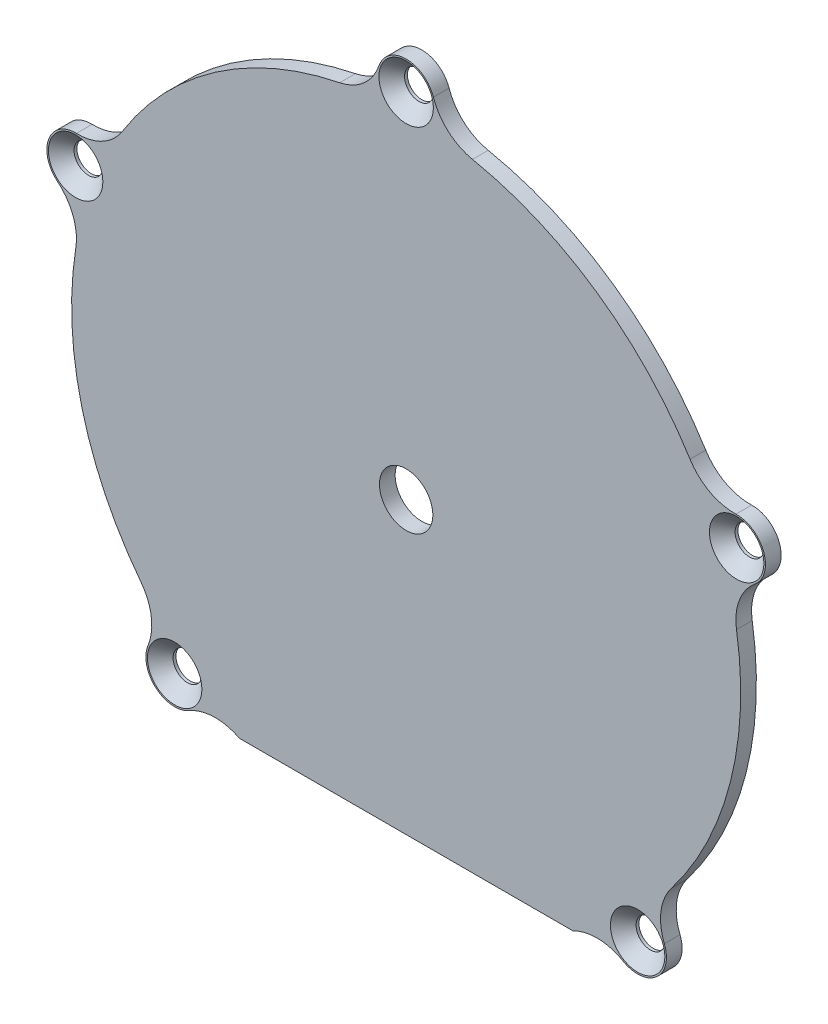
ISO-10303-21;
HEADER;
FILE_DESCRIPTION(('STEP AP214'),'2;1');
FILE_NAME('part.step','',(''),(''),'','','');
FILE_SCHEMA(('AUTOMOTIVE_DESIGN { 1 0 10303 214 1 1 1 1 }'));
ENDSEC;
DATA;
#1=APPLICATION_CONTEXT('core data for automotive mechanical design processes');
#2=APPLICATION_PROTOCOL_DEFINITION('international standard','automotive_design',2000,#1);
#3=PRODUCT_CONTEXT('',#1,'mechanical');
#4=PRODUCT('Part','Part','',(#3));
#5=PRODUCT_RELATED_PRODUCT_CATEGORY('part','',(#4));
#6=PRODUCT_DEFINITION_FORMATION('','',#4);
#7=PRODUCT_DEFINITION_CONTEXT('part definition',#1,'design');
#8=PRODUCT_DEFINITION('design','',#6,#7);
#9=PRODUCT_DEFINITION_SHAPE('','',#8);
#10=(LENGTH_UNIT() NAMED_UNIT(*) SI_UNIT(.MILLI.,.METRE.));
#11=(NAMED_UNIT(*) PLANE_ANGLE_UNIT() SI_UNIT($,.RADIAN.));
#12=(NAMED_UNIT(*) SI_UNIT($,.STERADIAN.) SOLID_ANGLE_UNIT());
#13=UNCERTAINTY_MEASURE_WITH_UNIT(LENGTH_MEASURE(1.E-05),#10,'distance_accuracy_value','');
#14=(GEOMETRIC_REPRESENTATION_CONTEXT(3) GLOBAL_UNCERTAINTY_ASSIGNED_CONTEXT((#13)) GLOBAL_UNIT_ASSIGNED_CONTEXT((#10,
#11,#12)) REPRESENTATION_CONTEXT('',''));
#15=CARTESIAN_POINT('',(0.,0.,0.));
#16=DIRECTION('',(0.,0.,1.));
#17=DIRECTION('',(1.,0.,0.));
#18=AXIS2_PLACEMENT_3D('',#15,#16,#17);
#19=CARTESIAN_POINT('',(-36.4504390235777,-64.2826614521123,3.));
#20=DIRECTION('',(0.,0.,-1.));
#21=DIRECTION('',(-1.,0.,0.));
#22=AXIS2_PLACEMENT_3D('',#19,#20,#21);
#23=CYLINDRICAL_SURFACE('',#22,10.);
#24=CARTESIAN_POINT('',(-36.4504390235777,-64.2826614521123,0.));
#25=DIRECTION('',(0.,0.,-1.));
#26=DIRECTION('',(1.,0.,0.));
#27=AXIS2_PLACEMENT_3D('',#24,#25,#26);
#28=CIRCLE('',#27,10.);
#29=CARTESIAN_POINT('',(-41.4645158414446,-55.6305499373126,0.));
#30=VERTEX_POINT('',#29);
#31=CARTESIAN_POINT('',(-31.8457301336344,-55.4059133967219,0.));
#32=VERTEX_POINT('',#31);
#33=EDGE_CURVE('E203',#30,#32,#28,.T.);
#34=ORIENTED_EDGE('',*,*,#33,.T.);
#35=DIRECTION('',(0.,0.,-1.));
#36=VECTOR('',#35,1.);
#37=CARTESIAN_POINT('',(-31.8457301336344,-55.4059133967219,3.));
#38=LINE('',#37,#36);
#39=CARTESIAN_POINT('',(-31.8457301336344,-55.4059133967219,3.));
#40=VERTEX_POINT('',#39);
#41=EDGE_CURVE('E11',#40,#32,#38,.T.);
#42=ORIENTED_EDGE('',*,*,#41,.F.);
#43=CARTESIAN_POINT('',(-36.4504390235777,-64.2826614521123,3.));
#44=DIRECTION('',(0.,0.,-1.));
#45=DIRECTION('',(1.,0.,0.));
#46=AXIS2_PLACEMENT_3D('',#43,#44,#45);
#47=CIRCLE('',#46,10.);
#48=CARTESIAN_POINT('',(-41.4645158414446,-55.6305499373126,3.));
#49=VERTEX_POINT('',#48);
#50=EDGE_CURVE('E242',#49,#40,#47,.T.);
#51=ORIENTED_EDGE('',*,*,#50,.F.);
#52=DIRECTION('',(0.,0.,-1.));
#53=VECTOR('',#52,1.);
#54=CARTESIAN_POINT('',(-41.4645158414446,-55.6305499373126,3.));
#55=LINE('',#54,#53);
#56=EDGE_CURVE('E199',#49,#30,#55,.T.);
#57=ORIENTED_EDGE('',*,*,#56,.T.);
#58=EDGE_LOOP('',(#34,#42,#51,#57));
#59=FACE_BOUND('',#58,.T.);
#60=ADVANCED_FACE('F35',(#59),#23,.F.);
#61=CARTESIAN_POINT('',(0.,-55.4059133967219,3.));
#62=DIRECTION('',(0.,1.,0.));
#63=DIRECTION('',(0.,0.,1.));
#64=AXIS2_PLACEMENT_3D('',#61,#62,#63);
#65=PLANE('',#64);
#66=DIRECTION('',(1.,0.,0.));
#67=VECTOR('',#66,1.);
#68=CARTESIAN_POINT('',(0.,-55.4059133967219,0.));
#69=LINE('',#68,#67);
#70=CARTESIAN_POINT('',(31.8457301336344,-55.4059133967219,0.));
#71=VERTEX_POINT('',#70);
#72=EDGE_CURVE('E206',#32,#71,#69,.T.);
#73=ORIENTED_EDGE('',*,*,#72,.T.);
#74=DIRECTION('',(0.,0.,-1.));
#75=VECTOR('',#74,1.);
#76=CARTESIAN_POINT('',(31.8457301336344,-55.4059133967219,3.));
#77=LINE('',#76,#75);
#78=CARTESIAN_POINT('',(31.8457301336344,-55.4059133967219,3.));
#79=VERTEX_POINT('',#78);
#80=EDGE_CURVE('E43',#79,#71,#77,.T.);
#81=ORIENTED_EDGE('',*,*,#80,.F.);
#82=DIRECTION('',(1.,0.,0.));
#83=VECTOR('',#82,1.);
#84=CARTESIAN_POINT('',(-31.8457301336344,-55.4059133967219,3.));
#85=LINE('',#84,#83);
#86=EDGE_CURVE('E130',#40,#79,#85,.T.);
#87=ORIENTED_EDGE('',*,*,#86,.F.);
#88=ORIENTED_EDGE('',*,*,#41,.T.);
#89=EDGE_LOOP('',(#73,#81,#87,#88));
#90=FACE_BOUND('',#89,.T.);
#91=ADVANCED_FACE('F362',(#90),#65,.F.);
#92=CARTESIAN_POINT('',(36.4504390235777,-64.2826614521123,3.));
#93=DIRECTION('',(0.,0.,-1.));
#94=DIRECTION('',(-1.,0.,0.));
#95=AXIS2_PLACEMENT_3D('',#92,#93,#94);
#96=CYLINDRICAL_SURFACE('',#95,10.);
#97=CARTESIAN_POINT('',(36.4504390235777,-64.2826614521123,0.));
#98=DIRECTION('',(0.,0.,-1.));
#99=DIRECTION('',(1.,0.,0.));
#100=AXIS2_PLACEMENT_3D('',#97,#98,#99);
#101=CIRCLE('',#100,10.);
#102=CARTESIAN_POINT('',(41.4645158414446,-55.6305499373126,0.));
#103=VERTEX_POINT('',#102);
#104=EDGE_CURVE('E209',#71,#103,#101,.T.);
#105=ORIENTED_EDGE('',*,*,#104,.T.);
#106=DIRECTION('',(0.,0.,-1.));
#107=VECTOR('',#106,1.);
#108=CARTESIAN_POINT('',(41.4645158414446,-55.6305499373126,3.));
#109=LINE('',#108,#107);
#110=CARTESIAN_POINT('',(41.4645158414446,-55.6305499373126,3.));
#111=VERTEX_POINT('',#110);
#112=EDGE_CURVE('E285',#111,#103,#109,.T.);
#113=ORIENTED_EDGE('',*,*,#112,.F.);
#114=CARTESIAN_POINT('',(36.4504390235777,-64.2826614521123,3.));
#115=DIRECTION('',(0.,0.,-1.));
#116=DIRECTION('',(1.,0.,0.));
#117=AXIS2_PLACEMENT_3D('',#114,#115,#116);
#118=CIRCLE('',#117,10.);
#119=EDGE_CURVE('E293',#79,#111,#118,.T.);
#120=ORIENTED_EDGE('',*,*,#119,.F.);
#121=ORIENTED_EDGE('',*,*,#80,.T.);
#122=EDGE_LOOP('',(#105,#113,#120,#121));
#123=FACE_BOUND('',#122,.T.);
#124=ADVANCED_FACE('F291',(#123),#96,.F.);
#125=CARTESIAN_POINT('',(44.2222580912713,-50.8718886041727,3.));
#126=DIRECTION('',(0.,0.,-1.));
#127=DIRECTION('',(-1.,0.,0.));
#128=AXIS2_PLACEMENT_3D('',#125,#126,#127);
#129=CYLINDRICAL_SURFACE('',#128,5.5);
#130=CARTESIAN_POINT('',(44.2222580912713,-50.8718886041727,0.));
#131=DIRECTION('',(0.,0.,1.));
#132=DIRECTION('',(1.,0.,0.));
#133=AXIS2_PLACEMENT_3D('',#130,#131,#132);
#134=CIRCLE('',#133,5.5);
#135=CARTESIAN_POINT('',(49.3196553754128,-48.8063279229951,0.));
#136=VERTEX_POINT('',#135);
#137=EDGE_CURVE('E211',#103,#136,#134,.T.);
#138=ORIENTED_EDGE('',*,*,#137,.T.);
#139=DIRECTION('',(0.,0.,-1.));
#140=VECTOR('',#139,1.);
#141=CARTESIAN_POINT('',(49.3196553754128,-48.8063279229951,3.));
#142=LINE('',#141,#140);
#143=CARTESIAN_POINT('',(49.3196553754128,-48.8063279229951,3.));
#144=VERTEX_POINT('',#143);
#145=EDGE_CURVE('E282',#144,#136,#142,.T.);
#146=ORIENTED_EDGE('',*,*,#145,.F.);
#147=CARTESIAN_POINT('',(44.2222580912713,-50.8718886041727,3.));
#148=DIRECTION('',(0.,0.,1.));
#149=DIRECTION('',(1.,0.,0.));
#150=AXIS2_PLACEMENT_3D('',#147,#148,#149);
#151=CIRCLE('',#150,5.5);
#152=EDGE_CURVE('E311',#111,#144,#151,.T.);
#153=ORIENTED_EDGE('',*,*,#152,.F.);
#154=ORIENTED_EDGE('',*,*,#112,.T.);
#155=EDGE_LOOP('',(#138,#146,#153,#154));
#156=FACE_BOUND('',#155,.T.);
#157=ADVANCED_FACE('F302',(#156),#129,.T.);
#158=CARTESIAN_POINT('',(58.5876504374882,-45.0507630481266,3.));
#159=DIRECTION('',(0.,0.,-1.));
#160=DIRECTION('',(-1.,0.,0.));
#161=AXIS2_PLACEMENT_3D('',#158,#159,#160);
#162=CYLINDRICAL_SURFACE('',#161,10.);
#163=CARTESIAN_POINT('',(58.5876504374882,-45.0507630481266,0.));
#164=DIRECTION('',(0.,0.,-1.));
#165=DIRECTION('',(1.,0.,0.));
#166=AXIS2_PLACEMENT_3D('',#163,#164,#165);
#167=CIRCLE('',#166,10.);
#168=CARTESIAN_POINT('',(50.6603212503102,-38.9550717864142,0.));
#169=VERTEX_POINT('',#168);
#170=EDGE_CURVE('E213',#136,#169,#167,.T.);
#171=ORIENTED_EDGE('',*,*,#170,.T.);
#172=DIRECTION('',(0.,0.,-1.));
#173=VECTOR('',#172,1.);
#174=CARTESIAN_POINT('',(50.6603212503102,-38.9550717864142,3.));
#175=LINE('',#174,#173);
#176=CARTESIAN_POINT('',(50.6603212503102,-38.9550717864142,3.));
#177=VERTEX_POINT('',#176);
#178=EDGE_CURVE('E279',#177,#169,#175,.T.);
#179=ORIENTED_EDGE('',*,*,#178,.F.);
#180=CARTESIAN_POINT('',(58.5876504374882,-45.0507630481266,3.));
#181=DIRECTION('',(0.,0.,-1.));
#182=DIRECTION('',(1.,0.,0.));
#183=AXIS2_PLACEMENT_3D('',#180,#181,#182);
#184=CIRCLE('',#183,10.);
#185=EDGE_CURVE('E308',#144,#177,#184,.T.);
#186=ORIENTED_EDGE('',*,*,#185,.F.);
#187=ORIENTED_EDGE('',*,*,#145,.T.);
#188=EDGE_LOOP('',(#171,#179,#186,#187));
#189=FACE_BOUND('',#188,.T.);
#190=ADVANCED_FACE('F306',(#189),#162,.F.);
#191=CARTESIAN_POINT('',(0.,0.,3.));
#192=DIRECTION('',(0.,0.,-1.));
#193=DIRECTION('',(-1.,0.,0.));
#194=AXIS2_PLACEMENT_3D('',#191,#192,#193);
#195=CYLINDRICAL_SURFACE('',#194,63.9059133967219);
#196=CARTESIAN_POINT('',(0.,0.,0.));
#197=DIRECTION('',(0.,0.,1.));
#198=DIRECTION('',(1.,0.,0.));
#199=AXIS2_PLACEMENT_3D('',#196,#197,#198);
#200=CIRCLE('',#199,63.9059133967219);
#201=CARTESIAN_POINT('',(63.1089110071548,10.0613676287241,0.));
#202=VERTEX_POINT('',#201);
#203=EDGE_CURVE('E215',#169,#202,#200,.T.);
#204=ORIENTED_EDGE('',*,*,#203,.T.);
#205=DIRECTION('',(0.,0.,-1.));
#206=VECTOR('',#205,1.);
#207=CARTESIAN_POINT('',(63.1089110071548,10.0613676287241,3.));
#208=LINE('',#207,#206);
#209=CARTESIAN_POINT('',(63.1089110071548,10.0613676287241,3.));
#210=VERTEX_POINT('',#209);
#211=EDGE_CURVE('E276',#210,#202,#208,.T.);
#212=ORIENTED_EDGE('',*,*,#211,.F.);
#213=CARTESIAN_POINT('',(0.,0.,3.));
#214=DIRECTION('',(0.,0.,1.));
#215=DIRECTION('',(1.,0.,0.));
#216=AXIS2_PLACEMENT_3D('',#213,#214,#215);
#217=CIRCLE('',#216,63.9059133967219);
#218=EDGE_CURVE('E310',#177,#210,#217,.T.);
#219=ORIENTED_EDGE('',*,*,#218,.F.);
#220=ORIENTED_EDGE('',*,*,#178,.T.);
#221=EDGE_LOOP('',(#204,#212,#219,#220));
#222=FACE_BOUND('',#221,.T.);
#223=ADVANCED_FACE('F375',(#222),#195,.T.);
#224=CARTESIAN_POINT('',(72.9841960399154,11.6357708558972,3.));
#225=DIRECTION('',(0.,0.,-1.));
#226=DIRECTION('',(-1.,0.,0.));
#227=AXIS2_PLACEMENT_3D('',#224,#225,#226);
#228=CYLINDRICAL_SURFACE('',#227,10.);
#229=CARTESIAN_POINT('',(72.9841960399154,11.6357708558972,0.));
#230=DIRECTION('',(0.,0.,-1.));
#231=DIRECTION('',(1.,0.,0.));
#232=AXIS2_PLACEMENT_3D('',#229,#230,#231);
#233=CIRCLE('',#232,10.);
#234=CARTESIAN_POINT('',(66.6313240590638,19.3585305695559,0.));
#235=VERTEX_POINT('',#234);
#236=EDGE_CURVE('E217',#202,#235,#233,.T.);
#237=ORIENTED_EDGE('',*,*,#236,.T.);
#238=DIRECTION('',(0.,0.,-1.));
#239=VECTOR('',#238,1.);
#240=CARTESIAN_POINT('',(66.6313240590638,19.3585305695559,3.));
#241=LINE('',#240,#239);
#242=CARTESIAN_POINT('',(66.6313240590638,19.3585305695559,3.));
#243=VERTEX_POINT('',#242);
#244=EDGE_CURVE('E273',#243,#235,#241,.T.);
#245=ORIENTED_EDGE('',*,*,#244,.F.);
#246=CARTESIAN_POINT('',(72.9841960399154,11.6357708558972,3.));
#247=DIRECTION('',(0.,0.,-1.));
#248=DIRECTION('',(1.,0.,0.));
#249=AXIS2_PLACEMENT_3D('',#246,#247,#248);
#250=CIRCLE('',#249,10.);
#251=EDGE_CURVE('E313',#210,#243,#250,.T.);
#252=ORIENTED_EDGE('',*,*,#251,.F.);
#253=ORIENTED_EDGE('',*,*,#211,.T.);
#254=EDGE_LOOP('',(#237,#245,#252,#253));
#255=FACE_BOUND('',#254,.T.);
#256=ADVANCED_FACE('F378',(#255),#228,.F.);
#257=CARTESIAN_POINT('',(63.1372444695955,23.6060484120683,3.));
#258=DIRECTION('',(0.,0.,-1.));
#259=DIRECTION('',(-1.,0.,0.));
#260=AXIS2_PLACEMENT_3D('',#257,#258,#259);
#261=CYLINDRICAL_SURFACE('',#260,5.5);
#262=CARTESIAN_POINT('',(63.1372444695955,23.6060484120683,0.));
#263=DIRECTION('',(0.,0.,1.));
#264=DIRECTION('',(1.,0.,0.));
#265=AXIS2_PLACEMENT_3D('',#262,#263,#264);
#266=CIRCLE('',#265,5.5);
#267=CARTESIAN_POINT('',(62.9876373784496,29.1040132826617,0.));
#268=VERTEX_POINT('',#267);
#269=EDGE_CURVE('E219',#235,#268,#266,.T.);
#270=ORIENTED_EDGE('',*,*,#269,.T.);
#271=DIRECTION('',(0.,0.,-1.));
#272=VECTOR('',#271,1.);
#273=CARTESIAN_POINT('',(62.9876373784496,29.1040132826617,3.));
#274=LINE('',#273,#272);
#275=CARTESIAN_POINT('',(62.9876373784496,29.1040132826617,3.));
#276=VERTEX_POINT('',#275);
#277=EDGE_CURVE('E270',#276,#268,#274,.T.);
#278=ORIENTED_EDGE('',*,*,#277,.F.);
#279=CARTESIAN_POINT('',(63.1372444695955,23.6060484120683,3.));
#280=DIRECTION('',(0.,0.,1.));
#281=DIRECTION('',(1.,0.,0.));
#282=AXIS2_PLACEMENT_3D('',#279,#280,#281);
#283=CIRCLE('',#282,5.5);
#284=EDGE_CURVE('E319',#243,#276,#283,.T.);
#285=ORIENTED_EDGE('',*,*,#284,.F.);
#286=ORIENTED_EDGE('',*,*,#244,.T.);
#287=EDGE_LOOP('',(#270,#278,#285,#286));
#288=FACE_BOUND('',#287,.T.);
#289=ADVANCED_FACE('F382',(#288),#261,.T.);
#290=CARTESIAN_POINT('',(62.7156244854572,39.1003130473769,3.));
#291=DIRECTION('',(0.,0.,-1.));
#292=DIRECTION('',(-1.,0.,0.));
#293=AXIS2_PLACEMENT_3D('',#290,#291,#292);
#294=CYLINDRICAL_SURFACE('',#293,10.);
#295=CARTESIAN_POINT('',(62.7156244854572,39.1003130473769,0.));
#296=DIRECTION('',(0.,0.,-1.));
#297=DIRECTION('',(1.,0.,0.));
#298=AXIS2_PLACEMENT_3D('',#295,#296,#297);
#299=CIRCLE('',#298,10.);
#300=CARTESIAN_POINT('',(54.2297508113435,33.8097603364606,0.));
#301=VERTEX_POINT('',#300);
#302=EDGE_CURVE('E221',#268,#301,#299,.T.);
#303=ORIENTED_EDGE('',*,*,#302,.T.);
#304=DIRECTION('',(0.,0.,-1.));
#305=VECTOR('',#304,1.);
#306=CARTESIAN_POINT('',(54.2297508113435,33.8097603364606,3.));
#307=LINE('',#306,#305);
#308=CARTESIAN_POINT('',(54.2297508113435,33.8097603364606,3.));
#309=VERTEX_POINT('',#308);
#310=EDGE_CURVE('E267',#309,#301,#307,.T.);
#311=ORIENTED_EDGE('',*,*,#310,.F.);
#312=CARTESIAN_POINT('',(62.7156244854572,39.1003130473769,3.));
#313=DIRECTION('',(0.,0.,-1.));
#314=DIRECTION('',(1.,0.,0.));
#315=AXIS2_PLACEMENT_3D('',#312,#313,#314);
#316=CIRCLE('',#315,10.);
#317=EDGE_CURVE('E321',#276,#309,#316,.T.);
#318=ORIENTED_EDGE('',*,*,#317,.F.);
#319=ORIENTED_EDGE('',*,*,#277,.T.);
#320=EDGE_LOOP('',(#303,#311,#318,#319));
#321=FACE_BOUND('',#320,.T.);
#322=ADVANCED_FACE('F386',(#321),#294,.F.);
#323=CARTESIAN_POINT('',(0.,0.,3.));
#324=DIRECTION('',(0.,0.,-1.));
#325=DIRECTION('',(-1.,0.,0.));
#326=AXIS2_PLACEMENT_3D('',#323,#324,#325);
#327=CYLINDRICAL_SURFACE('',#326,63.9059133967219);
#328=CARTESIAN_POINT('',(0.,0.,0.));
#329=DIRECTION('',(0.,0.,1.));
#330=DIRECTION('',(1.,0.,0.));
#331=AXIS2_PLACEMENT_3D('',#328,#329,#330);
#332=CIRCLE('',#331,63.9059133967219);
#333=CARTESIAN_POINT('',(12.6770032143223,62.6359270432982,0.));
#334=VERTEX_POINT('',#333);
#335=EDGE_CURVE('E223',#301,#334,#332,.T.);
#336=ORIENTED_EDGE('',*,*,#335,.T.);
#337=DIRECTION('',(0.,0.,-1.));
#338=VECTOR('',#337,1.);
#339=CARTESIAN_POINT('',(12.6770032143223,62.6359270432982,3.));
#340=LINE('',#339,#338);
#341=CARTESIAN_POINT('',(12.6770032143223,62.6359270432982,3.));
#342=VERTEX_POINT('',#341);
#343=EDGE_CURVE('E264',#342,#334,#340,.T.);
#344=ORIENTED_EDGE('',*,*,#343,.F.);
#345=CARTESIAN_POINT('',(0.,0.,3.));
#346=DIRECTION('',(0.,0.,1.));
#347=DIRECTION('',(1.,0.,0.));
#348=AXIS2_PLACEMENT_3D('',#345,#346,#347);
#349=CIRCLE('',#348,63.9059133967219);
#350=EDGE_CURVE('E323',#309,#342,#349,.T.);
#351=ORIENTED_EDGE('',*,*,#350,.F.);
#352=ORIENTED_EDGE('',*,*,#310,.T.);
#353=EDGE_LOOP('',(#336,#344,#351,#352));
#354=FACE_BOUND('',#353,.T.);
#355=ADVANCED_FACE('F390',(#354),#327,.T.);
#356=CARTESIAN_POINT('',(14.6607012072803,72.4371995256209,3.));
#357=DIRECTION('',(0.,0.,-1.));
#358=DIRECTION('',(-1.,0.,0.));
#359=AXIS2_PLACEMENT_3D('',#356,#357,#358);
#360=CYLINDRICAL_SURFACE('',#359,10.);
#361=CARTESIAN_POINT('',(14.6607012072803,72.4371995256209,0.));
#362=DIRECTION('',(0.,0.,-1.));
#363=DIRECTION('',(1.,0.,0.));
#364=AXIS2_PLACEMENT_3D('',#361,#362,#363);
#365=CIRCLE('',#364,10.);
#366=CARTESIAN_POINT('',(5.20218429935753,69.1912084747183,0.));
#367=VERTEX_POINT('',#366);
#368=EDGE_CURVE('E225',#334,#367,#365,.T.);
#369=ORIENTED_EDGE('',*,*,#368,.T.);
#370=DIRECTION('',(0.,0.,-1.));
#371=VECTOR('',#370,1.);
#372=CARTESIAN_POINT('',(5.20218429935753,69.1912084747183,3.));
#373=LINE('',#372,#371);
#374=CARTESIAN_POINT('',(5.20218429935753,69.1912084747183,3.));
#375=VERTEX_POINT('',#374);
#376=EDGE_CURVE('E261',#375,#367,#373,.T.);
#377=ORIENTED_EDGE('',*,*,#376,.F.);
#378=CARTESIAN_POINT('',(14.6607012072803,72.4371995256209,3.));
#379=DIRECTION('',(0.,0.,-1.));
#380=DIRECTION('',(1.,0.,0.));
#381=AXIS2_PLACEMENT_3D('',#378,#379,#380);
#382=CIRCLE('',#381,10.);
#383=EDGE_CURVE('E325',#342,#375,#382,.T.);
#384=ORIENTED_EDGE('',*,*,#383,.F.);
#385=ORIENTED_EDGE('',*,*,#343,.T.);
#386=EDGE_LOOP('',(#369,#377,#384,#385));
#387=FACE_BOUND('',#386,.T.);
#388=ADVANCED_FACE('F394',(#387),#360,.F.);
#389=CARTESIAN_POINT('',(0.,67.4059133967219,3.));
#390=DIRECTION('',(0.,0.,-1.));
#391=DIRECTION('',(-1.,0.,0.));
#392=AXIS2_PLACEMENT_3D('',#389,#390,#391);
#393=CYLINDRICAL_SURFACE('',#392,5.50000000000001);
#394=CARTESIAN_POINT('',(0.,67.4059133967219,0.));
#395=DIRECTION('',(0.,0.,1.));
#396=DIRECTION('',(1.,0.,0.));
#397=AXIS2_PLACEMENT_3D('',#394,#395,#396);
#398=CIRCLE('',#397,5.50000000000001);
#399=CARTESIAN_POINT('',(-5.20218429935752,69.1912084747183,0.));
#400=VERTEX_POINT('',#399);
#401=EDGE_CURVE('E227',#367,#400,#398,.T.);
#402=ORIENTED_EDGE('',*,*,#401,.T.);
#403=DIRECTION('',(0.,0.,-1.));
#404=VECTOR('',#403,1.);
#405=CARTESIAN_POINT('',(-5.20218429935752,69.1912084747183,3.));
#406=LINE('',#405,#404);
#407=CARTESIAN_POINT('',(-5.20218429935752,69.1912084747183,3.));
#408=VERTEX_POINT('',#407);
#409=EDGE_CURVE('E258',#408,#400,#406,.T.);
#410=ORIENTED_EDGE('',*,*,#409,.F.);
#411=CARTESIAN_POINT('',(0.,67.4059133967219,3.));
#412=DIRECTION('',(0.,0.,1.));
#413=DIRECTION('',(1.,0.,0.));
#414=AXIS2_PLACEMENT_3D('',#411,#412,#413);
#415=CIRCLE('',#414,5.50000000000001);
#416=EDGE_CURVE('E327',#375,#408,#415,.T.);
#417=ORIENTED_EDGE('',*,*,#416,.F.);
#418=ORIENTED_EDGE('',*,*,#376,.T.);
#419=EDGE_LOOP('',(#402,#410,#417,#418));
#420=FACE_BOUND('',#419,.T.);
#421=ADVANCED_FACE('F398',(#420),#393,.T.);
#422=CARTESIAN_POINT('',(-14.6607012072803,72.4371995256209,3.));
#423=DIRECTION('',(0.,0.,-1.));
#424=DIRECTION('',(-1.,0.,0.));
#425=AXIS2_PLACEMENT_3D('',#422,#423,#424);
#426=CYLINDRICAL_SURFACE('',#425,10.);
#427=CARTESIAN_POINT('',(-14.6607012072803,72.4371995256209,0.));
#428=DIRECTION('',(0.,0.,-1.));
#429=DIRECTION('',(1.,0.,0.));
#430=AXIS2_PLACEMENT_3D('',#427,#428,#429);
#431=CIRCLE('',#430,10.);
#432=CARTESIAN_POINT('',(-12.6770032143223,62.6359270432982,0.));
#433=VERTEX_POINT('',#432);
#434=EDGE_CURVE('E229',#400,#433,#431,.T.);
#435=ORIENTED_EDGE('',*,*,#434,.T.);
#436=DIRECTION('',(0.,0.,-1.));
#437=VECTOR('',#436,1.);
#438=CARTESIAN_POINT('',(-12.6770032143223,62.6359270432982,3.));
#439=LINE('',#438,#437);
#440=CARTESIAN_POINT('',(-12.6770032143223,62.6359270432982,3.));
#441=VERTEX_POINT('',#440);
#442=EDGE_CURVE('E255',#441,#433,#439,.T.);
#443=ORIENTED_EDGE('',*,*,#442,.F.);
#444=CARTESIAN_POINT('',(-14.6607012072803,72.4371995256209,3.));
#445=DIRECTION('',(0.,0.,-1.));
#446=DIRECTION('',(1.,0.,0.));
#447=AXIS2_PLACEMENT_3D('',#444,#445,#446);
#448=CIRCLE('',#447,10.);
#449=EDGE_CURVE('E329',#408,#441,#448,.T.);
#450=ORIENTED_EDGE('',*,*,#449,.F.);
#451=ORIENTED_EDGE('',*,*,#409,.T.);
#452=EDGE_LOOP('',(#435,#443,#450,#451));
#453=FACE_BOUND('',#452,.T.);
#454=ADVANCED_FACE('F402',(#453),#426,.F.);
#455=CARTESIAN_POINT('',(0.,0.,3.));
#456=DIRECTION('',(0.,0.,-1.));
#457=DIRECTION('',(-1.,0.,0.));
#458=AXIS2_PLACEMENT_3D('',#455,#456,#457);
#459=CYLINDRICAL_SURFACE('',#458,63.9059133967219);
#460=CARTESIAN_POINT('',(0.,0.,0.));
#461=DIRECTION('',(0.,0.,1.));
#462=DIRECTION('',(1.,0.,0.));
#463=AXIS2_PLACEMENT_3D('',#460,#461,#462);
#464=CIRCLE('',#463,63.9059133967219);
#465=CARTESIAN_POINT('',(-54.2297508113435,33.8097603364606,0.));
#466=VERTEX_POINT('',#465);
#467=EDGE_CURVE('E231',#433,#466,#464,.T.);
#468=ORIENTED_EDGE('',*,*,#467,.T.);
#469=DIRECTION('',(0.,0.,-1.));
#470=VECTOR('',#469,1.);
#471=CARTESIAN_POINT('',(-54.2297508113435,33.8097603364606,3.));
#472=LINE('',#471,#470);
#473=CARTESIAN_POINT('',(-54.2297508113435,33.8097603364606,3.));
#474=VERTEX_POINT('',#473);
#475=EDGE_CURVE('E252',#474,#466,#472,.T.);
#476=ORIENTED_EDGE('',*,*,#475,.F.);
#477=CARTESIAN_POINT('',(0.,0.,3.));
#478=DIRECTION('',(0.,0.,1.));
#479=DIRECTION('',(1.,0.,0.));
#480=AXIS2_PLACEMENT_3D('',#477,#478,#479);
#481=CIRCLE('',#480,63.9059133967219);
#482=EDGE_CURVE('E331',#441,#474,#481,.T.);
#483=ORIENTED_EDGE('',*,*,#482,.F.);
#484=ORIENTED_EDGE('',*,*,#442,.T.);
#485=EDGE_LOOP('',(#468,#476,#483,#484));
#486=FACE_BOUND('',#485,.T.);
#487=ADVANCED_FACE('F406',(#486),#459,.T.);
#488=CARTESIAN_POINT('',(-62.7156244854572,39.1003130473769,3.));
#489=DIRECTION('',(0.,0.,-1.));
#490=DIRECTION('',(-1.,0.,0.));
#491=AXIS2_PLACEMENT_3D('',#488,#489,#490);
#492=CYLINDRICAL_SURFACE('',#491,10.);
#493=CARTESIAN_POINT('',(-62.7156244854572,39.1003130473769,0.));
#494=DIRECTION('',(0.,0.,-1.));
#495=DIRECTION('',(1.,0.,0.));
#496=AXIS2_PLACEMENT_3D('',#493,#494,#495);
#497=CIRCLE('',#496,10.);
#498=CARTESIAN_POINT('',(-62.9876373784496,29.1040132826617,0.));
#499=VERTEX_POINT('',#498);
#500=EDGE_CURVE('E233',#466,#499,#497,.T.);
#501=ORIENTED_EDGE('',*,*,#500,.T.);
#502=DIRECTION('',(0.,0.,-1.));
#503=VECTOR('',#502,1.);
#504=CARTESIAN_POINT('',(-62.9876373784496,29.1040132826617,3.));
#505=LINE('',#504,#503);
#506=CARTESIAN_POINT('',(-62.9876373784496,29.1040132826617,3.));
#507=VERTEX_POINT('',#506);
#508=EDGE_CURVE('E249',#507,#499,#505,.T.);
#509=ORIENTED_EDGE('',*,*,#508,.F.);
#510=CARTESIAN_POINT('',(-62.7156244854572,39.1003130473769,3.));
#511=DIRECTION('',(0.,0.,-1.));
#512=DIRECTION('',(1.,0.,0.));
#513=AXIS2_PLACEMENT_3D('',#510,#511,#512);
#514=CIRCLE('',#513,10.);
#515=EDGE_CURVE('E333',#474,#507,#514,.T.);
#516=ORIENTED_EDGE('',*,*,#515,.F.);
#517=ORIENTED_EDGE('',*,*,#475,.T.);
#518=EDGE_LOOP('',(#501,#509,#516,#517));
#519=FACE_BOUND('',#518,.T.);
#520=ADVANCED_FACE('F410',(#519),#492,.F.);
#521=CARTESIAN_POINT('',(-63.1372444695955,23.6060484120683,3.));
#522=DIRECTION('',(0.,0.,-1.));
#523=DIRECTION('',(-1.,0.,0.));
#524=AXIS2_PLACEMENT_3D('',#521,#522,#523);
#525=CYLINDRICAL_SURFACE('',#524,5.5);
#526=CARTESIAN_POINT('',(-63.1372444695955,23.6060484120683,0.));
#527=DIRECTION('',(0.,0.,1.));
#528=DIRECTION('',(1.,0.,0.));
#529=AXIS2_PLACEMENT_3D('',#526,#527,#528);
#530=CIRCLE('',#529,5.5);
#531=CARTESIAN_POINT('',(-66.6313240590638,19.3585305695559,0.));
#532=VERTEX_POINT('',#531);
#533=EDGE_CURVE('E235',#499,#532,#530,.T.);
#534=ORIENTED_EDGE('',*,*,#533,.T.);
#535=DIRECTION('',(0.,0.,-1.));
#536=VECTOR('',#535,1.);
#537=CARTESIAN_POINT('',(-66.6313240590638,19.3585305695559,3.));
#538=LINE('',#537,#536);
#539=CARTESIAN_POINT('',(-66.6313240590638,19.3585305695559,3.));
#540=VERTEX_POINT('',#539);
#541=EDGE_CURVE('E246',#540,#532,#538,.T.);
#542=ORIENTED_EDGE('',*,*,#541,.F.);
#543=CARTESIAN_POINT('',(-63.1372444695955,23.6060484120683,3.));
#544=DIRECTION('',(0.,0.,1.));
#545=DIRECTION('',(1.,0.,0.));
#546=AXIS2_PLACEMENT_3D('',#543,#544,#545);
#547=CIRCLE('',#546,5.5);
#548=EDGE_CURVE('E335',#507,#540,#547,.T.);
#549=ORIENTED_EDGE('',*,*,#548,.F.);
#550=ORIENTED_EDGE('',*,*,#508,.T.);
#551=EDGE_LOOP('',(#534,#542,#549,#550));
#552=FACE_BOUND('',#551,.T.);
#553=ADVANCED_FACE('F341',(#552),#525,.T.);
#554=CARTESIAN_POINT('',(-72.9841960399154,11.6357708558972,3.));
#555=DIRECTION('',(0.,0.,-1.));
#556=DIRECTION('',(-1.,0.,0.));
#557=AXIS2_PLACEMENT_3D('',#554,#555,#556);
#558=CYLINDRICAL_SURFACE('',#557,10.);
#559=CARTESIAN_POINT('',(-72.9841960399154,11.6357708558972,0.));
#560=DIRECTION('',(0.,0.,-1.));
#561=DIRECTION('',(1.,0.,0.));
#562=AXIS2_PLACEMENT_3D('',#559,#560,#561);
#563=CIRCLE('',#562,10.);
#564=CARTESIAN_POINT('',(-63.1089110071548,10.0613676287241,0.));
#565=VERTEX_POINT('',#564);
#566=EDGE_CURVE('E237',#532,#565,#563,.T.);
#567=ORIENTED_EDGE('',*,*,#566,.T.);
#568=DIRECTION('',(0.,0.,-1.));
#569=VECTOR('',#568,1.);
#570=CARTESIAN_POINT('',(-63.1089110071548,10.0613676287241,3.));
#571=LINE('',#570,#569);
#572=CARTESIAN_POINT('',(-63.1089110071548,10.0613676287241,3.));
#573=VERTEX_POINT('',#572);
#574=EDGE_CURVE('E194',#573,#565,#571,.T.);
#575=ORIENTED_EDGE('',*,*,#574,.F.);
#576=CARTESIAN_POINT('',(-72.9841960399154,11.6357708558972,3.));
#577=DIRECTION('',(0.,0.,-1.));
#578=DIRECTION('',(1.,0.,0.));
#579=AXIS2_PLACEMENT_3D('',#576,#577,#578);
#580=CIRCLE('',#579,10.);
#581=EDGE_CURVE('E185',#540,#573,#580,.T.);
#582=ORIENTED_EDGE('',*,*,#581,.F.);
#583=ORIENTED_EDGE('',*,*,#541,.T.);
#584=EDGE_LOOP('',(#567,#575,#582,#583));
#585=FACE_BOUND('',#584,.T.);
#586=ADVANCED_FACE('F345',(#585),#558,.F.);
#587=CARTESIAN_POINT('',(0.,0.,3.));
#588=DIRECTION('',(0.,0.,-1.));
#589=DIRECTION('',(-1.,0.,0.));
#590=AXIS2_PLACEMENT_3D('',#587,#588,#589);
#591=CYLINDRICAL_SURFACE('',#590,63.9059133967219);
#592=CARTESIAN_POINT('',(0.,0.,0.));
#593=DIRECTION('',(0.,0.,1.));
#594=DIRECTION('',(1.,0.,0.));
#595=AXIS2_PLACEMENT_3D('',#592,#593,#594);
#596=CIRCLE('',#595,63.9059133967219);
#597=CARTESIAN_POINT('',(-50.6603212503102,-38.9550717864142,0.));
#598=VERTEX_POINT('',#597);
#599=EDGE_CURVE('E193',#565,#598,#596,.T.);
#600=ORIENTED_EDGE('',*,*,#599,.T.);
#601=DIRECTION('',(0.,0.,-1.));
#602=VECTOR('',#601,1.);
#603=CARTESIAN_POINT('',(-50.6603212503102,-38.9550717864142,3.));
#604=LINE('',#603,#602);
#605=CARTESIAN_POINT('',(-50.6603212503102,-38.9550717864142,3.));
#606=VERTEX_POINT('',#605);
#607=EDGE_CURVE('E190',#606,#598,#604,.T.);
#608=ORIENTED_EDGE('',*,*,#607,.F.);
#609=CARTESIAN_POINT('',(0.,0.,3.));
#610=DIRECTION('',(0.,0.,1.));
#611=DIRECTION('',(1.,0.,0.));
#612=AXIS2_PLACEMENT_3D('',#609,#610,#611);
#613=CIRCLE('',#612,63.9059133967219);
#614=EDGE_CURVE('E179',#573,#606,#613,.T.);
#615=ORIENTED_EDGE('',*,*,#614,.F.);
#616=ORIENTED_EDGE('',*,*,#574,.T.);
#617=EDGE_LOOP('',(#600,#608,#615,#616));
#618=FACE_BOUND('',#617,.T.);
#619=ADVANCED_FACE('F191',(#618),#591,.T.);
#620=CARTESIAN_POINT('',(-58.5876504374882,-45.0507630481266,3.));
#621=DIRECTION('',(0.,0.,-1.));
#622=DIRECTION('',(-1.,0.,0.));
#623=AXIS2_PLACEMENT_3D('',#620,#621,#622);
#624=CYLINDRICAL_SURFACE('',#623,10.);
#625=CARTESIAN_POINT('',(-58.5876504374882,-45.0507630481266,0.));
#626=DIRECTION('',(0.,0.,-1.));
#627=DIRECTION('',(1.,0.,0.));
#628=AXIS2_PLACEMENT_3D('',#625,#626,#627);
#629=CIRCLE('',#628,10.);
#630=CARTESIAN_POINT('',(-49.3196553754128,-48.8063279229951,0.));
#631=VERTEX_POINT('',#630);
#632=EDGE_CURVE('E116',#598,#631,#629,.T.);
#633=ORIENTED_EDGE('',*,*,#632,.T.);
#634=DIRECTION('',(0.,0.,-1.));
#635=VECTOR('',#634,1.);
#636=CARTESIAN_POINT('',(-49.3196553754128,-48.8063279229951,3.));
#637=LINE('',#636,#635);
#638=CARTESIAN_POINT('',(-49.3196553754128,-48.8063279229951,3.));
#639=VERTEX_POINT('',#638);
#640=EDGE_CURVE('E195',#639,#631,#637,.T.);
#641=ORIENTED_EDGE('',*,*,#640,.F.);
#642=CARTESIAN_POINT('',(-58.5876504374882,-45.0507630481266,3.));
#643=DIRECTION('',(0.,0.,-1.));
#644=DIRECTION('',(1.,0.,0.));
#645=AXIS2_PLACEMENT_3D('',#642,#643,#644);
#646=CIRCLE('',#645,10.);
#647=EDGE_CURVE('E183',#606,#639,#646,.T.);
#648=ORIENTED_EDGE('',*,*,#647,.F.);
#649=ORIENTED_EDGE('',*,*,#607,.T.);
#650=EDGE_LOOP('',(#633,#641,#648,#649));
#651=FACE_BOUND('',#650,.T.);
#652=ADVANCED_FACE('F197',(#651),#624,.F.);
#653=CARTESIAN_POINT('',(-44.2222580912713,-50.8718886041727,3.));
#654=DIRECTION('',(0.,0.,-1.));
#655=DIRECTION('',(-1.,0.,0.));
#656=AXIS2_PLACEMENT_3D('',#653,#654,#655);
#657=CYLINDRICAL_SURFACE('',#656,5.50000000000001);
#658=CARTESIAN_POINT('',(-44.2222580912713,-50.8718886041727,0.));
#659=DIRECTION('',(0.,0.,1.));
#660=DIRECTION('',(1.,0.,0.));
#661=AXIS2_PLACEMENT_3D('',#658,#659,#660);
#662=CIRCLE('',#661,5.50000000000001);
#663=EDGE_CURVE('E122',#631,#30,#662,.T.);
#664=ORIENTED_EDGE('',*,*,#663,.T.);
#665=ORIENTED_EDGE('',*,*,#56,.F.);
#666=CARTESIAN_POINT('',(-44.2222580912713,-50.8718886041727,3.));
#667=DIRECTION('',(0.,0.,1.));
#668=DIRECTION('',(1.,0.,0.));
#669=AXIS2_PLACEMENT_3D('',#666,#667,#668);
#670=CIRCLE('',#669,5.50000000000001);
#671=EDGE_CURVE('E51',#639,#49,#670,.T.);
#672=ORIENTED_EDGE('',*,*,#671,.F.);
#673=ORIENTED_EDGE('',*,*,#640,.T.);
#674=EDGE_LOOP('',(#664,#665,#672,#673));
#675=FACE_BOUND('',#674,.T.);
#676=ADVANCED_FACE('F349',(#675),#657,.T.);
#677=CARTESIAN_POINT('',(-36.4504390235777,-64.2826614521123,3.));
#678=DIRECTION('',(0.,0.,1.));
#679=DIRECTION('',(1.,0.,0.));
#680=AXIS2_PLACEMENT_3D('',#677,#678,#679);
#681=PLANE('',#680);
#682=CARTESIAN_POINT('',(0.,0.,3.));
#683=DIRECTION('',(0.,0.,1.));
#684=DIRECTION('',(1.,0.,0.));
#685=AXIS2_PLACEMENT_3D('',#682,#683,#684);
#686=CIRCLE('',#685,5.1);
#687=CARTESIAN_POINT('',(5.1,0.,3.));
#688=VERTEX_POINT('',#687);
#689=EDGE_CURVE('E561',#688,#688,#686,.T.);
#690=ORIENTED_EDGE('',*,*,#689,.F.);
#691=EDGE_LOOP('',(#690));
#692=FACE_BOUND('',#691,.T.);
#693=CARTESIAN_POINT('',(-63.1372444695955,23.6060484120683,3.));
#694=DIRECTION('',(0.,0.,1.));
#695=DIRECTION('',(1.,0.,0.));
#696=AXIS2_PLACEMENT_3D('',#693,#694,#695);
#697=CIRCLE('',#696,5.2);
#698=CARTESIAN_POINT('',(-57.9372444695955,23.6060484120683,3.));
#699=VERTEX_POINT('',#698);
#700=EDGE_CURVE('E563',#699,#699,#697,.T.);
#701=ORIENTED_EDGE('',*,*,#700,.F.);
#702=EDGE_LOOP('',(#701));
#703=FACE_BOUND('',#702,.T.);
#704=CARTESIAN_POINT('',(0.,67.4059133967219,3.));
#705=DIRECTION('',(0.,0.,1.));
#706=DIRECTION('',(1.,0.,0.));
#707=AXIS2_PLACEMENT_3D('',#704,#705,#706);
#708=CIRCLE('',#707,5.2);
#709=CARTESIAN_POINT('',(5.2,67.4059133967219,3.));
#710=VERTEX_POINT('',#709);
#711=EDGE_CURVE('E574',#710,#710,#708,.T.);
#712=ORIENTED_EDGE('',*,*,#711,.F.);
#713=EDGE_LOOP('',(#712));
#714=FACE_BOUND('',#713,.T.);
#715=CARTESIAN_POINT('',(63.1372444695955,23.6060484120683,3.));
#716=DIRECTION('',(0.,0.,1.));
#717=DIRECTION('',(1.,0.,0.));
#718=AXIS2_PLACEMENT_3D('',#715,#716,#717);
#719=CIRCLE('',#718,5.2);
#720=CARTESIAN_POINT('',(68.3372444695955,23.6060484120683,3.));
#721=VERTEX_POINT('',#720);
#722=EDGE_CURVE('E583',#721,#721,#719,.T.);
#723=ORIENTED_EDGE('',*,*,#722,.F.);
#724=EDGE_LOOP('',(#723));
#725=FACE_BOUND('',#724,.T.);
#726=CARTESIAN_POINT('',(44.2222580912713,-50.8718886041727,3.));
#727=DIRECTION('',(0.,0.,1.));
#728=DIRECTION('',(1.,0.,0.));
#729=AXIS2_PLACEMENT_3D('',#726,#727,#728);
#730=CIRCLE('',#729,5.2);
#731=CARTESIAN_POINT('',(49.4222580912713,-50.8718886041727,3.));
#732=VERTEX_POINT('',#731);
#733=EDGE_CURVE('E592',#732,#732,#730,.T.);
#734=ORIENTED_EDGE('',*,*,#733,.F.);
#735=EDGE_LOOP('',(#734));
#736=FACE_BOUND('',#735,.T.);
#737=CARTESIAN_POINT('',(-44.2222580912713,-50.8718886041727,3.));
#738=DIRECTION('',(0.,0.,1.));
#739=DIRECTION('',(1.,0.,0.));
#740=AXIS2_PLACEMENT_3D('',#737,#738,#739);
#741=CIRCLE('',#740,5.2);
#742=CARTESIAN_POINT('',(-39.0222580912713,-50.8718886041727,3.));
#743=VERTEX_POINT('',#742);
#744=EDGE_CURVE('E601',#743,#743,#741,.T.);
#745=ORIENTED_EDGE('',*,*,#744,.F.);
#746=EDGE_LOOP('',(#745));
#747=FACE_BOUND('',#746,.T.);
#748=ORIENTED_EDGE('',*,*,#50,.T.);
#749=ORIENTED_EDGE('',*,*,#86,.T.);
#750=ORIENTED_EDGE('',*,*,#119,.T.);
#751=ORIENTED_EDGE('',*,*,#152,.T.);
#752=ORIENTED_EDGE('',*,*,#185,.T.);
#753=ORIENTED_EDGE('',*,*,#218,.T.);
#754=ORIENTED_EDGE('',*,*,#251,.T.);
#755=ORIENTED_EDGE('',*,*,#284,.T.);
#756=ORIENTED_EDGE('',*,*,#317,.T.);
#757=ORIENTED_EDGE('',*,*,#350,.T.);
#758=ORIENTED_EDGE('',*,*,#383,.T.);
#759=ORIENTED_EDGE('',*,*,#416,.T.);
#760=ORIENTED_EDGE('',*,*,#449,.T.);
#761=ORIENTED_EDGE('',*,*,#482,.T.);
#762=ORIENTED_EDGE('',*,*,#515,.T.);
#763=ORIENTED_EDGE('',*,*,#548,.T.);
#764=ORIENTED_EDGE('',*,*,#581,.T.);
#765=ORIENTED_EDGE('',*,*,#614,.T.);
#766=ORIENTED_EDGE('',*,*,#647,.T.);
#767=ORIENTED_EDGE('',*,*,#671,.T.);
#768=EDGE_LOOP('',(#748,#749,#750,#751,#752,#753,#754,#755,#756,#757,#758,#759,#760,#761,#762,
#763,#764,#765,#766,#767));
#769=FACE_BOUND('',#768,.T.);
#770=ADVANCED_FACE('F181',(#692,#703,#714,#725,#736,#747,#769),#681,.T.);
#771=CARTESIAN_POINT('',(-36.4504390235777,-64.2826614521123,0.));
#772=DIRECTION('',(0.,0.,1.));
#773=DIRECTION('',(1.,0.,0.));
#774=AXIS2_PLACEMENT_3D('',#771,#772,#773);
#775=PLANE('',#774);
#776=CARTESIAN_POINT('',(0.,0.,0.));
#777=DIRECTION('',(0.,0.,1.));
#778=DIRECTION('',(1.,0.,0.));
#779=AXIS2_PLACEMENT_3D('',#776,#777,#778);
#780=CIRCLE('',#779,5.1);
#781=CARTESIAN_POINT('',(5.1,0.,0.));
#782=VERTEX_POINT('',#781);
#783=EDGE_CURVE('E558',#782,#782,#780,.T.);
#784=ORIENTED_EDGE('',*,*,#783,.T.);
#785=EDGE_LOOP('',(#784));
#786=FACE_BOUND('',#785,.T.);
#787=CARTESIAN_POINT('',(-63.1372444695955,23.6060484120683,0.));
#788=DIRECTION('',(0.,0.,1.));
#789=DIRECTION('',(1.,0.,0.));
#790=AXIS2_PLACEMENT_3D('',#787,#788,#789);
#791=CIRCLE('',#790,2.75);
#792=CARTESIAN_POINT('',(-60.3872444695955,23.6060484120683,0.));
#793=VERTEX_POINT('',#792);
#794=EDGE_CURVE('E571',#793,#793,#791,.T.);
#795=ORIENTED_EDGE('',*,*,#794,.T.);
#796=EDGE_LOOP('',(#795));
#797=FACE_BOUND('',#796,.T.);
#798=CARTESIAN_POINT('',(0.,67.4059133967219,0.));
#799=DIRECTION('',(0.,0.,1.));
#800=DIRECTION('',(1.,0.,0.));
#801=AXIS2_PLACEMENT_3D('',#798,#799,#800);
#802=CIRCLE('',#801,2.75);
#803=CARTESIAN_POINT('',(2.75,67.4059133967219,0.));
#804=VERTEX_POINT('',#803);
#805=EDGE_CURVE('E580',#804,#804,#802,.T.);
#806=ORIENTED_EDGE('',*,*,#805,.T.);
#807=EDGE_LOOP('',(#806));
#808=FACE_BOUND('',#807,.T.);
#809=CARTESIAN_POINT('',(63.1372444695955,23.6060484120683,0.));
#810=DIRECTION('',(0.,0.,1.));
#811=DIRECTION('',(1.,0.,0.));
#812=AXIS2_PLACEMENT_3D('',#809,#810,#811);
#813=CIRCLE('',#812,2.74999999999999);
#814=CARTESIAN_POINT('',(65.8872444695955,23.6060484120683,0.));
#815=VERTEX_POINT('',#814);
#816=EDGE_CURVE('E589',#815,#815,#813,.T.);
#817=ORIENTED_EDGE('',*,*,#816,.T.);
#818=EDGE_LOOP('',(#817));
#819=FACE_BOUND('',#818,.T.);
#820=CARTESIAN_POINT('',(44.2222580912713,-50.8718886041727,0.));
#821=DIRECTION('',(0.,0.,1.));
#822=DIRECTION('',(1.,0.,0.));
#823=AXIS2_PLACEMENT_3D('',#820,#821,#822);
#824=CIRCLE('',#823,2.75);
#825=CARTESIAN_POINT('',(46.9722580912713,-50.8718886041727,0.));
#826=VERTEX_POINT('',#825);
#827=EDGE_CURVE('E598',#826,#826,#824,.T.);
#828=ORIENTED_EDGE('',*,*,#827,.T.);
#829=EDGE_LOOP('',(#828));
#830=FACE_BOUND('',#829,.T.);
#831=CARTESIAN_POINT('',(-44.2222580912713,-50.8718886041727,0.));
#832=DIRECTION('',(0.,0.,1.));
#833=DIRECTION('',(1.,0.,0.));
#834=AXIS2_PLACEMENT_3D('',#831,#832,#833);
#835=CIRCLE('',#834,2.75);
#836=CARTESIAN_POINT('',(-41.4722580912713,-50.8718886041727,0.));
#837=VERTEX_POINT('',#836);
#838=EDGE_CURVE('E207',#837,#837,#835,.T.);
#839=ORIENTED_EDGE('',*,*,#838,.T.);
#840=EDGE_LOOP('',(#839));
#841=FACE_BOUND('',#840,.T.);
#842=ORIENTED_EDGE('',*,*,#33,.F.);
#843=ORIENTED_EDGE('',*,*,#663,.F.);
#844=ORIENTED_EDGE('',*,*,#632,.F.);
#845=ORIENTED_EDGE('',*,*,#599,.F.);
#846=ORIENTED_EDGE('',*,*,#566,.F.);
#847=ORIENTED_EDGE('',*,*,#533,.F.);
#848=ORIENTED_EDGE('',*,*,#500,.F.);
#849=ORIENTED_EDGE('',*,*,#467,.F.);
#850=ORIENTED_EDGE('',*,*,#434,.F.);
#851=ORIENTED_EDGE('',*,*,#401,.F.);
#852=ORIENTED_EDGE('',*,*,#368,.F.);
#853=ORIENTED_EDGE('',*,*,#335,.F.);
#854=ORIENTED_EDGE('',*,*,#302,.F.);
#855=ORIENTED_EDGE('',*,*,#269,.F.);
#856=ORIENTED_EDGE('',*,*,#236,.F.);
#857=ORIENTED_EDGE('',*,*,#203,.F.);
#858=ORIENTED_EDGE('',*,*,#170,.F.);
#859=ORIENTED_EDGE('',*,*,#137,.F.);
#860=ORIENTED_EDGE('',*,*,#104,.F.);
#861=ORIENTED_EDGE('',*,*,#72,.F.);
#862=EDGE_LOOP('',(#842,#843,#844,#845,#846,#847,#848,#849,#850,#851,#852,#853,#854,#855,#856,
#857,#858,#859,#860,#861));
#863=FACE_BOUND('',#862,.T.);
#864=ADVANCED_FACE('F297',(#786,#797,#808,#819,#830,#841,#863),#775,.F.);
#865=CARTESIAN_POINT('',(-44.2222580912713,-50.8718886041727,3.));
#866=DIRECTION('',(0.,0.,1.));
#867=DIRECTION('',(1.,0.,0.));
#868=AXIS2_PLACEMENT_3D('',#865,#866,#867);
#869=CYLINDRICAL_SURFACE('',#868,2.75);
#870=ORIENTED_EDGE('',*,*,#838,.F.);
#871=EDGE_LOOP('',(#870));
#872=FACE_BOUND('',#871,.T.);
#873=CARTESIAN_POINT('',(-44.2222580912713,-50.8718886041727,0.549999999999992));
#874=DIRECTION('',(0.,0.,1.));
#875=DIRECTION('',(1.,0.,0.));
#876=AXIS2_PLACEMENT_3D('',#873,#874,#875);
#877=CIRCLE('',#876,2.75);
#878=CARTESIAN_POINT('',(-41.4722580912713,-50.8718886041727,0.549999999999992));
#879=VERTEX_POINT('',#878);
#880=EDGE_CURVE('E604',#879,#879,#877,.T.);
#881=ORIENTED_EDGE('',*,*,#880,.T.);
#882=EDGE_LOOP('',(#881));
#883=FACE_BOUND('',#882,.T.);
#884=ADVANCED_FACE('F438',(#872,#883),#869,.F.);
#885=CARTESIAN_POINT('',(-44.2222580912713,-50.8718886041727,3.));
#886=DIRECTION('',(0.,0.,1.));
#887=DIRECTION('',(1.,0.,0.));
#888=AXIS2_PLACEMENT_3D('',#885,#886,#887);
#889=CONICAL_SURFACE('',#888,5.2,0.785398163397448);
#890=ORIENTED_EDGE('',*,*,#880,.F.);
#891=EDGE_LOOP('',(#890));
#892=FACE_BOUND('',#891,.T.);
#893=ORIENTED_EDGE('',*,*,#744,.T.);
#894=EDGE_LOOP('',(#893));
#895=FACE_BOUND('',#894,.T.);
#896=ADVANCED_FACE('F443',(#892,#895),#889,.F.);
#897=CARTESIAN_POINT('',(44.2222580912713,-50.8718886041727,3.));
#898=DIRECTION('',(0.,0.,1.));
#899=DIRECTION('',(1.,0.,0.));
#900=AXIS2_PLACEMENT_3D('',#897,#898,#899);
#901=CYLINDRICAL_SURFACE('',#900,2.75);
#902=ORIENTED_EDGE('',*,*,#827,.F.);
#903=EDGE_LOOP('',(#902));
#904=FACE_BOUND('',#903,.T.);
#905=CARTESIAN_POINT('',(44.2222580912713,-50.8718886041727,0.549999999999992));
#906=DIRECTION('',(0.,0.,1.));
#907=DIRECTION('',(1.,0.,0.));
#908=AXIS2_PLACEMENT_3D('',#905,#906,#907);
#909=CIRCLE('',#908,2.75);
#910=CARTESIAN_POINT('',(46.9722580912713,-50.8718886041727,0.549999999999992));
#911=VERTEX_POINT('',#910);
#912=EDGE_CURVE('E595',#911,#911,#909,.T.);
#913=ORIENTED_EDGE('',*,*,#912,.T.);
#914=EDGE_LOOP('',(#913));
#915=FACE_BOUND('',#914,.T.);
#916=ADVANCED_FACE('F455',(#904,#915),#901,.F.);
#917=CARTESIAN_POINT('',(44.2222580912713,-50.8718886041727,3.));
#918=DIRECTION('',(0.,0.,1.));
#919=DIRECTION('',(1.,0.,0.));
#920=AXIS2_PLACEMENT_3D('',#917,#918,#919);
#921=CONICAL_SURFACE('',#920,5.2,0.785398163397448);
#922=ORIENTED_EDGE('',*,*,#912,.F.);
#923=EDGE_LOOP('',(#922));
#924=FACE_BOUND('',#923,.T.);
#925=ORIENTED_EDGE('',*,*,#733,.T.);
#926=EDGE_LOOP('',(#925));
#927=FACE_BOUND('',#926,.T.);
#928=ADVANCED_FACE('F465',(#924,#927),#921,.F.);
#929=CARTESIAN_POINT('',(63.1372444695955,23.6060484120683,3.));
#930=DIRECTION('',(0.,0.,1.));
#931=DIRECTION('',(1.,0.,0.));
#932=AXIS2_PLACEMENT_3D('',#929,#930,#931);
#933=CYLINDRICAL_SURFACE('',#932,2.74999999999999);
#934=ORIENTED_EDGE('',*,*,#816,.F.);
#935=EDGE_LOOP('',(#934));
#936=FACE_BOUND('',#935,.T.);
#937=CARTESIAN_POINT('',(63.1372444695955,23.6060484120683,0.549999999999992));
#938=DIRECTION('',(0.,0.,1.));
#939=DIRECTION('',(1.,0.,0.));
#940=AXIS2_PLACEMENT_3D('',#937,#938,#939);
#941=CIRCLE('',#940,2.74999999999999);
#942=CARTESIAN_POINT('',(65.8872444695955,23.6060484120683,0.549999999999992));
#943=VERTEX_POINT('',#942);
#944=EDGE_CURVE('E586',#943,#943,#941,.T.);
#945=ORIENTED_EDGE('',*,*,#944,.T.);
#946=EDGE_LOOP('',(#945));
#947=FACE_BOUND('',#946,.T.);
#948=ADVANCED_FACE('F475',(#936,#947),#933,.F.);
#949=CARTESIAN_POINT('',(63.1372444695955,23.6060484120683,3.));
#950=DIRECTION('',(0.,0.,1.));
#951=DIRECTION('',(1.,0.,0.));
#952=AXIS2_PLACEMENT_3D('',#949,#950,#951);
#953=CONICAL_SURFACE('',#952,5.2,0.785398163397448);
#954=ORIENTED_EDGE('',*,*,#944,.F.);
#955=EDGE_LOOP('',(#954));
#956=FACE_BOUND('',#955,.T.);
#957=ORIENTED_EDGE('',*,*,#722,.T.);
#958=EDGE_LOOP('',(#957));
#959=FACE_BOUND('',#958,.T.);
#960=ADVANCED_FACE('F485',(#956,#959),#953,.F.);
#961=CARTESIAN_POINT('',(0.,67.4059133967219,3.));
#962=DIRECTION('',(0.,0.,1.));
#963=DIRECTION('',(1.,0.,0.));
#964=AXIS2_PLACEMENT_3D('',#961,#962,#963);
#965=CYLINDRICAL_SURFACE('',#964,2.75);
#966=ORIENTED_EDGE('',*,*,#805,.F.);
#967=EDGE_LOOP('',(#966));
#968=FACE_BOUND('',#967,.T.);
#969=CARTESIAN_POINT('',(0.,67.4059133967219,0.549999999999992));
#970=DIRECTION('',(0.,0.,1.));
#971=DIRECTION('',(1.,0.,0.));
#972=AXIS2_PLACEMENT_3D('',#969,#970,#971);
#973=CIRCLE('',#972,2.75);
#974=CARTESIAN_POINT('',(2.75,67.4059133967219,0.549999999999992));
#975=VERTEX_POINT('',#974);
#976=EDGE_CURVE('E577',#975,#975,#973,.T.);
#977=ORIENTED_EDGE('',*,*,#976,.T.);
#978=EDGE_LOOP('',(#977));
#979=FACE_BOUND('',#978,.T.);
#980=ADVANCED_FACE('F495',(#968,#979),#965,.F.);
#981=CARTESIAN_POINT('',(0.,67.4059133967219,3.));
#982=DIRECTION('',(0.,0.,1.));
#983=DIRECTION('',(1.,0.,0.));
#984=AXIS2_PLACEMENT_3D('',#981,#982,#983);
#985=CONICAL_SURFACE('',#984,5.2,0.785398163397447);
#986=ORIENTED_EDGE('',*,*,#976,.F.);
#987=EDGE_LOOP('',(#986));
#988=FACE_BOUND('',#987,.T.);
#989=ORIENTED_EDGE('',*,*,#711,.T.);
#990=EDGE_LOOP('',(#989));
#991=FACE_BOUND('',#990,.T.);
#992=ADVANCED_FACE('F505',(#988,#991),#985,.F.);
#993=CARTESIAN_POINT('',(-63.1372444695955,23.6060484120683,3.));
#994=DIRECTION('',(0.,0.,1.));
#995=DIRECTION('',(1.,0.,0.));
#996=AXIS2_PLACEMENT_3D('',#993,#994,#995);
#997=CYLINDRICAL_SURFACE('',#996,2.75);
#998=ORIENTED_EDGE('',*,*,#794,.F.);
#999=EDGE_LOOP('',(#998));
#1000=FACE_BOUND('',#999,.T.);
#1001=CARTESIAN_POINT('',(-63.1372444695955,23.6060484120683,0.549999999999992));
#1002=DIRECTION('',(0.,0.,1.));
#1003=DIRECTION('',(1.,0.,0.));
#1004=AXIS2_PLACEMENT_3D('',#1001,#1002,#1003);
#1005=CIRCLE('',#1004,2.75);
#1006=CARTESIAN_POINT('',(-60.3872444695955,23.6060484120683,0.549999999999992));
#1007=VERTEX_POINT('',#1006);
#1008=EDGE_CURVE('E568',#1007,#1007,#1005,.T.);
#1009=ORIENTED_EDGE('',*,*,#1008,.T.);
#1010=EDGE_LOOP('',(#1009));
#1011=FACE_BOUND('',#1010,.T.);
#1012=ADVANCED_FACE('F515',(#1000,#1011),#997,.F.);
#1013=CARTESIAN_POINT('',(-63.1372444695955,23.6060484120683,3.));
#1014=DIRECTION('',(0.,0.,1.));
#1015=DIRECTION('',(1.,0.,0.));
#1016=AXIS2_PLACEMENT_3D('',#1013,#1014,#1015);
#1017=CONICAL_SURFACE('',#1016,5.2,0.785398163397447);
#1018=ORIENTED_EDGE('',*,*,#1008,.F.);
#1019=EDGE_LOOP('',(#1018));
#1020=FACE_BOUND('',#1019,.T.);
#1021=ORIENTED_EDGE('',*,*,#700,.T.);
#1022=EDGE_LOOP('',(#1021));
#1023=FACE_BOUND('',#1022,.T.);
#1024=ADVANCED_FACE('F525',(#1020,#1023),#1017,.F.);
#1025=CARTESIAN_POINT('',(0.,0.,0.));
#1026=DIRECTION('',(0.,0.,1.));
#1027=DIRECTION('',(1.,0.,0.));
#1028=AXIS2_PLACEMENT_3D('',#1025,#1026,#1027);
#1029=CYLINDRICAL_SURFACE('',#1028,5.1);
#1030=ORIENTED_EDGE('',*,*,#783,.F.);
#1031=EDGE_LOOP('',(#1030));
#1032=FACE_BOUND('',#1031,.T.);
#1033=ORIENTED_EDGE('',*,*,#689,.T.);
#1034=EDGE_LOOP('',(#1033));
#1035=FACE_BOUND('',#1034,.T.);
#1036=ADVANCED_FACE('F534',(#1032,#1035),#1029,.F.);
#1037=CLOSED_SHELL('',(#60,#91,#124,#157,#190,#223,#256,#289,#322,#355,#388,#421,#454,#487,#520,
#553,#586,#619,#652,#676,#770,#864,#884,#896,#916,#928,#948,#960,#980,#992,#1012,#1024,#1036));
#1038=MANIFOLD_SOLID_BREP('B2',#1037);
#1039=ADVANCED_BREP_SHAPE_REPRESENTATION('',(#18,#1038),#14);
#1040=SHAPE_DEFINITION_REPRESENTATION(#9,#1039);
ENDSEC;
END-ISO-10303-21;
